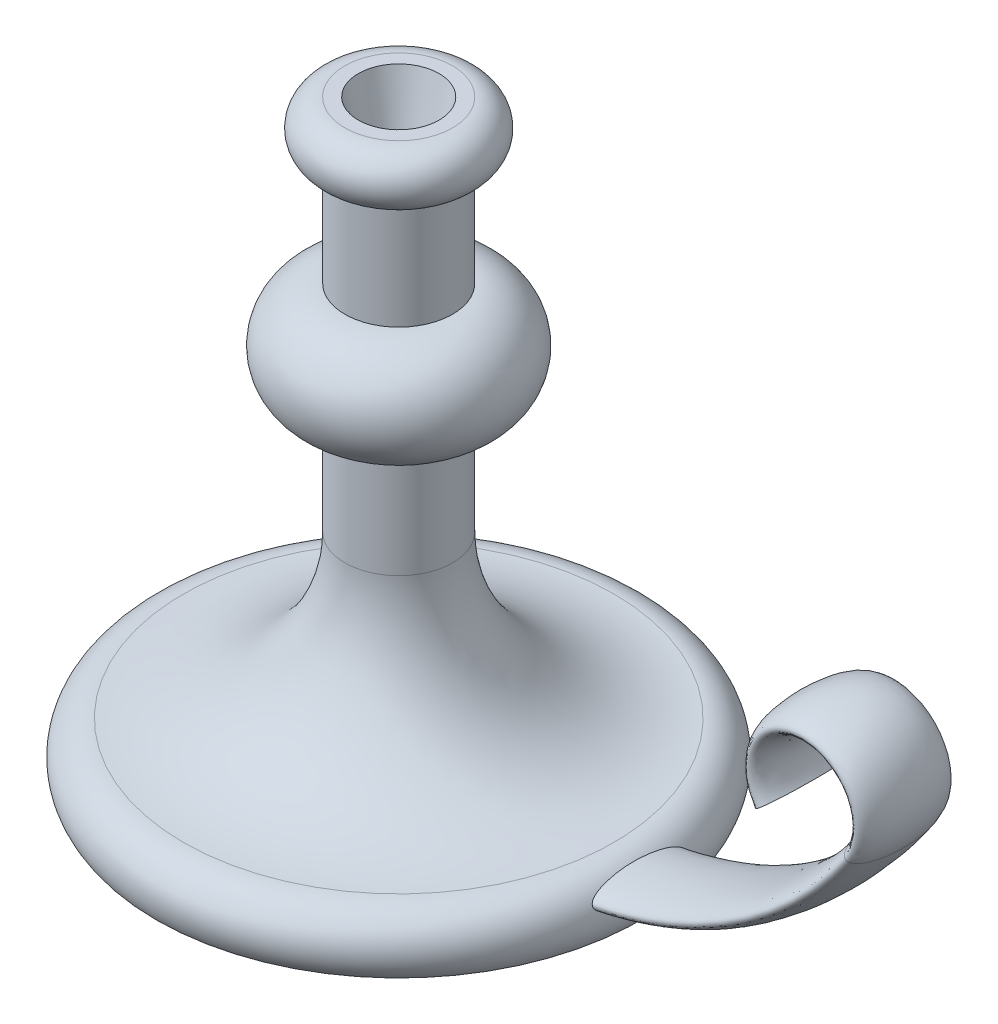
ISO-10303-21;
HEADER;
FILE_DESCRIPTION(('STEP AP214'),'2;1');
FILE_NAME('part.step','',(''),(''),'','','');
FILE_SCHEMA(('AUTOMOTIVE_DESIGN { 1 0 10303 214 1 1 1 1 }'));
ENDSEC;
DATA;
#1=APPLICATION_CONTEXT('core data for automotive mechanical design processes');
#2=APPLICATION_PROTOCOL_DEFINITION('international standard','automotive_design',2000,#1);
#3=PRODUCT_CONTEXT('',#1,'mechanical');
#4=PRODUCT('Part','Part','',(#3));
#5=PRODUCT_RELATED_PRODUCT_CATEGORY('part','',(#4));
#6=PRODUCT_DEFINITION_FORMATION('','',#4);
#7=PRODUCT_DEFINITION_CONTEXT('part definition',#1,'design');
#8=PRODUCT_DEFINITION('design','',#6,#7);
#9=PRODUCT_DEFINITION_SHAPE('','',#8);
#10=(LENGTH_UNIT() NAMED_UNIT(*) SI_UNIT(.MILLI.,.METRE.));
#11=(NAMED_UNIT(*) PLANE_ANGLE_UNIT() SI_UNIT($,.RADIAN.));
#12=(NAMED_UNIT(*) SI_UNIT($,.STERADIAN.) SOLID_ANGLE_UNIT());
#13=UNCERTAINTY_MEASURE_WITH_UNIT(LENGTH_MEASURE(1.E-05),#10,'distance_accuracy_value','');
#14=(GEOMETRIC_REPRESENTATION_CONTEXT(3) GLOBAL_UNCERTAINTY_ASSIGNED_CONTEXT((#13)) GLOBAL_UNIT_ASSIGNED_CONTEXT((#10,
#11,#12)) REPRESENTATION_CONTEXT('',''));
#15=CARTESIAN_POINT('',(0.,0.,0.));
#16=DIRECTION('',(0.,0.,1.));
#17=DIRECTION('',(1.,0.,0.));
#18=AXIS2_PLACEMENT_3D('',#15,#16,#17);
#19=CARTESIAN_POINT('',(0.,0.,0.));
#20=DIRECTION('',(0.,-1.,0.));
#21=DIRECTION('',(0.,0.,-1.));
#22=AXIS2_PLACEMENT_3D('',#19,#20,#21);
#23=PLANE('',#22);
#24=CARTESIAN_POINT('',(0.,0.,0.));
#25=DIRECTION('',(0.,-1.,0.));
#26=DIRECTION('',(0.,0.,-1.));
#27=AXIS2_PLACEMENT_3D('',#24,#25,#26);
#28=CIRCLE('',#27,90.);
#29=CARTESIAN_POINT('',(0.,0.,-90.));
#30=VERTEX_POINT('',#29);
#31=EDGE_CURVE('E82',#30,#30,#28,.T.);
#32=ORIENTED_EDGE('',*,*,#31,.T.);
#33=EDGE_LOOP('',(#32));
#34=FACE_BOUND('',#33,.T.);
#35=ADVANCED_FACE('F42',(#34),#23,.T.);
#36=CARTESIAN_POINT('',(0.,220.,0.));
#37=DIRECTION('',(0.,1.,0.));
#38=DIRECTION('',(0.,0.,1.));
#39=AXIS2_PLACEMENT_3D('',#36,#37,#38);
#40=PLANE('',#39);
#41=CARTESIAN_POINT('',(0.,220.,0.));
#42=DIRECTION('',(0.,1.,0.));
#43=DIRECTION('',(0.,0.,1.));
#44=AXIS2_PLACEMENT_3D('',#41,#42,#43);
#45=CIRCLE('',#44,15.);
#46=CARTESIAN_POINT('',(0.,220.,15.));
#47=VERTEX_POINT('',#46);
#48=EDGE_CURVE('E98',#47,#47,#45,.T.);
#49=ORIENTED_EDGE('',*,*,#48,.F.);
#50=EDGE_LOOP('',(#49));
#51=FACE_BOUND('',#50,.T.);
#52=CARTESIAN_POINT('',(0.,220.,0.));
#53=DIRECTION('',(0.,-1.,0.));
#54=DIRECTION('',(0.,0.,-1.));
#55=AXIS2_PLACEMENT_3D('',#52,#53,#54);
#56=CIRCLE('',#55,20.);
#57=CARTESIAN_POINT('',(0.,220.,-20.));
#58=VERTEX_POINT('',#57);
#59=EDGE_CURVE('E54',#58,#58,#56,.T.);
#60=ORIENTED_EDGE('',*,*,#59,.F.);
#61=EDGE_LOOP('',(#60));
#62=FACE_BOUND('',#61,.T.);
#63=ADVANCED_FACE('F105',(#51,#62),#40,.T.);
#64=CARTESIAN_POINT('',(0.,210.,0.));
#65=DIRECTION('',(0.,-1.,0.));
#66=DIRECTION('',(0.,0.,-1.));
#67=AXIS2_PLACEMENT_3D('',#64,#65,#66);
#68=TOROIDAL_SURFACE('',#67,20.,10.);
#69=ORIENTED_EDGE('',*,*,#59,.T.);
#70=EDGE_LOOP('',(#69));
#71=FACE_BOUND('',#70,.T.);
#72=CARTESIAN_POINT('',(0.,200.,0.));
#73=DIRECTION('',(0.,-1.,0.));
#74=DIRECTION('',(0.,0.,-1.));
#75=AXIS2_PLACEMENT_3D('',#72,#73,#74);
#76=CIRCLE('',#75,20.);
#77=CARTESIAN_POINT('',(0.,200.,-20.));
#78=VERTEX_POINT('',#77);
#79=EDGE_CURVE('E59',#78,#78,#76,.T.);
#80=ORIENTED_EDGE('',*,*,#79,.F.);
#81=EDGE_LOOP('',(#80));
#82=FACE_BOUND('',#81,.T.);
#83=ADVANCED_FACE('F108',(#71,#82),#68,.T.);
#84=CARTESIAN_POINT('',(0.,0.,0.));
#85=DIRECTION('',(0.,-1.,0.));
#86=DIRECTION('',(0.,0.,-1.));
#87=AXIS2_PLACEMENT_3D('',#84,#85,#86);
#88=CYLINDRICAL_SURFACE('',#87,20.);
#89=ORIENTED_EDGE('',*,*,#79,.T.);
#90=EDGE_LOOP('',(#89));
#91=FACE_BOUND('',#90,.T.);
#92=CARTESIAN_POINT('',(0.,160.,0.));
#93=DIRECTION('',(0.,-1.,0.));
#94=DIRECTION('',(0.,0.,-1.));
#95=AXIS2_PLACEMENT_3D('',#92,#93,#94);
#96=CIRCLE('',#95,20.);
#97=CARTESIAN_POINT('',(0.,160.,-20.));
#98=VERTEX_POINT('',#97);
#99=EDGE_CURVE('E64',#98,#98,#96,.T.);
#100=ORIENTED_EDGE('',*,*,#99,.F.);
#101=EDGE_LOOP('',(#100));
#102=FACE_BOUND('',#101,.T.);
#103=ADVANCED_FACE('F114',(#91,#102),#88,.T.);
#104=CARTESIAN_POINT('',(0.,140.,0.));
#105=DIRECTION('',(0.,-1.,0.));
#106=DIRECTION('',(0.,0.,-1.));
#107=AXIS2_PLACEMENT_3D('',#104,#105,#106);
#108=TOROIDAL_SURFACE('',#107,20.,20.);
#109=ORIENTED_EDGE('',*,*,#99,.T.);
#110=EDGE_LOOP('',(#109));
#111=FACE_BOUND('',#110,.T.);
#112=CARTESIAN_POINT('',(0.,120.,0.));
#113=DIRECTION('',(0.,-1.,0.));
#114=DIRECTION('',(0.,0.,-1.));
#115=AXIS2_PLACEMENT_3D('',#112,#113,#114);
#116=CIRCLE('',#115,20.);
#117=CARTESIAN_POINT('',(0.,120.,-20.));
#118=VERTEX_POINT('',#117);
#119=EDGE_CURVE('E70',#118,#118,#116,.T.);
#120=ORIENTED_EDGE('',*,*,#119,.F.);
#121=EDGE_LOOP('',(#120));
#122=FACE_BOUND('',#121,.T.);
#123=ADVANCED_FACE('F121',(#111,#122),#108,.T.);
#124=CARTESIAN_POINT('',(0.,0.,0.));
#125=DIRECTION('',(0.,-1.,0.));
#126=DIRECTION('',(0.,0.,-1.));
#127=AXIS2_PLACEMENT_3D('',#124,#125,#126);
#128=CYLINDRICAL_SURFACE('',#127,20.);
#129=ORIENTED_EDGE('',*,*,#119,.T.);
#130=EDGE_LOOP('',(#129));
#131=FACE_BOUND('',#130,.T.);
#132=CARTESIAN_POINT('',(0.,80.,0.));
#133=DIRECTION('',(0.,-1.,0.));
#134=DIRECTION('',(0.,0.,-1.));
#135=AXIS2_PLACEMENT_3D('',#132,#133,#134);
#136=CIRCLE('',#135,20.);
#137=CARTESIAN_POINT('',(0.,80.,-20.));
#138=VERTEX_POINT('',#137);
#139=EDGE_CURVE('E74',#138,#138,#136,.T.);
#140=ORIENTED_EDGE('',*,*,#139,.F.);
#141=EDGE_LOOP('',(#140));
#142=FACE_BOUND('',#141,.T.);
#143=ADVANCED_FACE('F125',(#131,#142),#128,.T.);
#144=CARTESIAN_POINT('',(0.,80.,0.));
#145=DIRECTION('',(0.,-1.,0.));
#146=DIRECTION('',(0.,0.,-1.));
#147=AXIS2_PLACEMENT_3D('',#144,#145,#146);
#148=TOROIDAL_SURFACE('',#147,80.,60.);
#149=ORIENTED_EDGE('',*,*,#139,.T.);
#150=EDGE_LOOP('',(#149));
#151=FACE_BOUND('',#150,.T.);
#152=CARTESIAN_POINT('',(0.,20.,0.));
#153=DIRECTION('',(0.,-1.,0.));
#154=DIRECTION('',(0.,0.,-1.));
#155=AXIS2_PLACEMENT_3D('',#152,#153,#154);
#156=CIRCLE('',#155,80.);
#157=CARTESIAN_POINT('',(0.,20.,-80.));
#158=VERTEX_POINT('',#157);
#159=EDGE_CURVE('E78',#158,#158,#156,.T.);
#160=ORIENTED_EDGE('',*,*,#159,.F.);
#161=EDGE_LOOP('',(#160));
#162=FACE_BOUND('',#161,.T.);
#163=ADVANCED_FACE('F129',(#151,#162),#148,.F.);
#164=CARTESIAN_POINT('',(0.,7.50000000000001,0.));
#165=DIRECTION('',(0.,-1.,0.));
#166=DIRECTION('',(0.,0.,-1.));
#167=AXIS2_PLACEMENT_3D('',#164,#165,#166);
#168=TOROIDAL_SURFACE('',#167,80.,12.5);
#169=CARTESIAN_POINT('',(89.5597422043342,12.9414346567555,17.5));
#170=CARTESIAN_POINT('',(89.5807278946485,12.8988393157081,17.5000019534777));
#171=CARTESIAN_POINT('',(89.6018125795404,12.8563039357769,17.4977816975197));
#172=CARTESIAN_POINT('',(89.6440155813562,12.7716938339371,17.489002543543));
#173=CARTESIAN_POINT('',(89.6651339056646,12.7296192360718,17.4824425050804));
#174=CARTESIAN_POINT('',(89.7283289297819,12.6045076597417,17.4565216692095));
#175=CARTESIAN_POINT('',(89.7702246464786,12.5226255894255,17.4309204730636));
#176=CARTESIAN_POINT('',(89.8644276523312,12.3407735771966,17.3563532007827));
#177=CARTESIAN_POINT('',(89.916211748319,12.242484901666,17.3027527423027));
#178=CARTESIAN_POINT('',(90.01638786814,12.0551458272008,17.178826321144));
#179=CARTESIAN_POINT('',(90.0647710548456,11.966119226993,17.1084587296403));
#180=CARTESIAN_POINT('',(90.1524531790238,11.806984522925,16.9652391551481));
#181=CARTESIAN_POINT('',(90.1921458014335,11.7358878994478,16.8936963434586));
#182=CARTESIAN_POINT('',(90.2690886261224,11.5996259068224,16.7438969488311));
#183=CARTESIAN_POINT('',(90.3063367280021,11.5344656201533,16.665634722265));
#184=CARTESIAN_POINT('',(90.3786756485819,11.4092540815106,16.5039763875565));
#185=CARTESIAN_POINT('',(90.4137624747614,11.349212210629,16.4205713158719));
#186=CARTESIAN_POINT('',(90.4819450166471,11.2336894025402,16.2499454917114));
#187=CARTESIAN_POINT('',(90.5150413047902,11.1782071523835,16.162725848809));
#188=CARTESIAN_POINT('',(90.5839705930101,11.063725182569,15.9728919395737));
#189=CARTESIAN_POINT('',(90.6195406839562,11.0053156128849,15.8698282905888));
#190=CARTESIAN_POINT('',(90.6886668526269,10.8929143897208,15.6606649910659));
#191=CARTESIAN_POINT('',(90.7222226971281,10.8389232475745,15.5545649910506));
#192=CARTESIAN_POINT('',(90.787486486134,10.7348751403119,15.3401290691865));
#193=CARTESIAN_POINT('',(90.8191972688173,10.6848120890841,15.2317969483067));
#194=CARTESIAN_POINT('',(90.881005962979,10.5880683385414,15.0131968985225));
#195=CARTESIAN_POINT('',(90.9111039714557,10.5413874357516,14.9029290865687));
#196=CARTESIAN_POINT('',(90.979897363352,10.4355491517099,14.6427529331226));
#197=CARTESIAN_POINT('',(91.0180072010883,10.377593665576,14.4922012075481));
#198=CARTESIAN_POINT('',(91.0918875553169,10.2663462891692,14.1888070722871));
#199=CARTESIAN_POINT('',(91.1276577411367,10.2130550577559,14.0359643425398));
#200=CARTESIAN_POINT('',(91.1971197458645,10.1105127689612,13.7282685712582));
#201=CARTESIAN_POINT('',(91.2308091946811,10.0612662985098,13.573413471871));
#202=CARTESIAN_POINT('',(91.2962483962878,9.966420445748,13.262180104172));
#203=CARTESIAN_POINT('',(91.3279980241889,9.92082129819993,13.1058017385396));
#204=CARTESIAN_POINT('',(91.4205951755327,9.78887458660798,12.6346162266685));
#205=CARTESIAN_POINT('',(91.4787589060981,9.70742476979595,12.3179025042442));
#206=CARTESIAN_POINT('',(91.5890957852254,9.55493826130153,11.6792188898602));
#207=CARTESIAN_POINT('',(91.641236506382,9.48395741425907,11.357230318611));
#208=CARTESIAN_POINT('',(91.7397682682944,9.35136221163198,10.7107316640823));
#209=CARTESIAN_POINT('',(91.7861636672357,9.28974074823247,10.3862236929834));
#210=CARTESIAN_POINT('',(91.873697660451,9.17463718318054,9.73512886653573));
#211=CARTESIAN_POINT('',(91.9148370779326,9.12115380666536,9.40854234516818));
#212=CARTESIAN_POINT('',(91.9930777751442,9.02031209920318,8.74630339912616));
#213=CARTESIAN_POINT('',(92.0300669877613,8.97311921137161,8.4106126926434));
#214=CARTESIAN_POINT('',(92.0991833927575,8.88559842477436,7.73783252743948));
#215=CARTESIAN_POINT('',(92.1313104056235,8.84527077946752,7.40074301754614));
#216=CARTESIAN_POINT('',(92.1909161961866,8.77092313439269,6.72537142355348));
#217=CARTESIAN_POINT('',(92.2183937480205,8.73690479789184,6.38708904887194));
#218=CARTESIAN_POINT('',(92.2688480816039,8.67476840304503,5.70964427774293));
#219=CARTESIAN_POINT('',(92.2918247141674,8.64665054027195,5.37048185250301));
#220=CARTESIAN_POINT('',(92.3540877228586,8.57076604630488,4.3536718124467));
#221=CARTESIAN_POINT('',(92.3868571977359,8.53128338370556,3.67498389641648));
#222=CARTESIAN_POINT('',(92.4356134743347,8.47274161832897,2.31614711504071));
#223=CARTESIAN_POINT('',(92.4515998737813,8.45368300509717,1.63599821506825));
#224=CARTESIAN_POINT('',(92.4661200478781,8.43637339284855,0.357955102331954));
#225=CARTESIAN_POINT('',(92.4665389208555,8.43587490179708,-0.239888856143647));
#226=CARTESIAN_POINT('',(92.4546362797528,8.4500624126083,-1.43536153859163));
#227=CARTESIAN_POINT('',(92.4423128974783,8.46475064105846,-2.03299021814841));
#228=CARTESIAN_POINT('',(92.4047541650815,8.5097668077993,-3.22745109478543));
#229=CARTESIAN_POINT('',(92.3795147316879,8.54009969200438,-3.82428298010723));
#230=CARTESIAN_POINT('',(92.3157217367252,8.61743320229677,-5.01694606233259));
#231=CARTESIAN_POINT('',(92.2771508465328,8.6644555239592,-5.61277493756129));
#232=CARTESIAN_POINT('',(92.1861026743767,8.77678784246256,-6.80153886380939));
#233=CARTESIAN_POINT('',(92.1336290020918,8.84209309262499,-7.3944746253509));
#234=CARTESIAN_POINT('',(92.0437550848418,8.95574227206711,-8.28055229820513));
#235=CARTESIAN_POINT('',(92.0119455213755,8.99622894552013,-8.57528682166727));
#236=CARTESIAN_POINT('',(91.9444204496405,9.08291539794888,-9.16346094428885));
#237=CARTESIAN_POINT('',(91.9087051114865,9.12911492811458,-9.45690059926715));
#238=CARTESIAN_POINT('',(91.8331309715697,9.22782929334068,-10.0422906036683));
#239=CARTESIAN_POINT('',(91.7932707518514,9.28034629056382,-10.3342404073468));
#240=CARTESIAN_POINT('',(91.7091179167369,9.3924506208163,-10.9161852811053));
#241=CARTESIAN_POINT('',(91.6648247441272,9.4520388428603,-11.2061801005452));
#242=CARTESIAN_POINT('',(91.571392572748,9.57931645333879,-11.7838191658169));
#243=CARTESIAN_POINT('',(91.5222504482681,9.64701107336925,-12.0714617643073));
#244=CARTESIAN_POINT('',(91.4186796874406,9.79172730085906,-12.6430805537631));
#245=CARTESIAN_POINT('',(91.3642572573635,9.86873798424095,-12.9270606150355));
#246=CARTESIAN_POINT('',(91.2493765391174,10.033952974788,-13.4904217181466));
#247=CARTESIAN_POINT('',(91.1889212109097,10.1221517983454,-13.7698049377448));
#248=CARTESIAN_POINT('',(91.0929373870874,10.2648274882363,-14.1839125047646));
#249=CARTESIAN_POINT('',(91.0600757486262,10.3140904181849,-14.3210581267387));
#250=CARTESIAN_POINT('',(90.9923938569386,10.4165511027192,-14.5933763477649));
#251=CARTESIAN_POINT('',(90.9575737807136,10.4697485018483,-14.7285491237344));
#252=CARTESIAN_POINT('',(90.8810851838776,10.5878451344079,-15.0138774923678));
#253=CARTESIAN_POINT('',(90.8391147723957,10.6533666208412,-15.1636969104748));
#254=CARTESIAN_POINT('',(90.7519625692612,10.7912189771815,-15.45932953559));
#255=CARTESIAN_POINT('',(90.7067794219568,10.8635527258308,-15.6051410149849));
#256=CARTESIAN_POINT('',(90.6128939496975,11.0160439629677,-15.8905749729623));
#257=CARTESIAN_POINT('',(90.5642084544311,11.0961646105685,-16.0302224467125));
#258=CARTESIAN_POINT('',(90.4624897667353,11.2662530107872,-16.3016394850687));
#259=CARTESIAN_POINT('',(90.4094613083907,11.3562100760681,-16.4334173639364));
#260=CARTESIAN_POINT('',(90.3114276481005,11.5255085385048,-16.6553108138959));
#261=CARTESIAN_POINT('',(90.2675273757817,11.6022608890606,-16.747864447136));
#262=CARTESIAN_POINT('',(90.1761749534326,11.7643292238687,-16.9236630994732));
#263=CARTESIAN_POINT('',(90.1287172073378,11.849658775493,-17.0068929161981));
#264=CARTESIAN_POINT('',(90.0292807633426,12.0313291797368,-17.160728121925));
#265=CARTESIAN_POINT('',(89.9772518064337,12.1277974407354,-17.2311575389091));
#266=CARTESIAN_POINT('',(89.8965437818878,12.2800613987941,-17.3212876850735));
#267=CARTESIAN_POINT('',(89.8692277989253,12.3320164153137,-17.3487242132161));
#268=CARTESIAN_POINT('',(89.8138320311431,12.4382955168478,-17.3975211145679));
#269=CARTESIAN_POINT('',(89.7857527202502,12.4926181439798,-17.4188851676711));
#270=CARTESIAN_POINT('',(89.7185869780335,12.6237048005598,-17.4611772226903));
#271=CARTESIAN_POINT('',(89.6792533408886,12.7013692224276,-17.4790502108363));
#272=CARTESIAN_POINT('',(89.6005512815564,12.8586256339485,-17.4997317533413));
#273=CARTESIAN_POINT('',(89.5611829132234,12.9382160139949,-17.5025524785485));
#274=CARTESIAN_POINT('',(89.4835317885697,13.0969633423244,-17.4927372657774));
#275=CARTESIAN_POINT('',(89.4452490812937,13.1761202708964,-17.4801006306501));
#276=CARTESIAN_POINT('',(89.3707047667355,13.3318071774563,-17.440649407729));
#277=CARTESIAN_POINT('',(89.3344452993772,13.4083343423531,-17.413820111618));
#278=CARTESIAN_POINT('',(89.2510611220236,13.5858554385683,-17.3357126521073));
#279=CARTESIAN_POINT('',(89.2050998650832,13.684982377722,-17.2790047620841));
#280=CARTESIAN_POINT('',(89.1180744174556,13.8744276311819,-17.1491670423827));
#281=CARTESIAN_POINT('',(89.0770301058259,13.9647099356686,-17.0759737821298));
#282=CARTESIAN_POINT('',(89.0037033744711,14.127143485757,-16.927057730704));
#283=CARTESIAN_POINT('',(88.9709541551903,14.2001945680732,-16.8525208708987));
#284=CARTESIAN_POINT('',(88.908496842619,14.3401811690449,-16.6970292692111));
#285=CARTESIAN_POINT('',(88.8787841266134,14.4071259665769,-16.6160846261893));
#286=CARTESIAN_POINT('',(88.8217814388549,14.5359995630882,-16.4490709627679));
#287=CARTESIAN_POINT('',(88.7944998605827,14.5979109242411,-16.3629857823211));
#288=CARTESIAN_POINT('',(88.742066743737,14.7171734064659,-16.1870697873632));
#289=CARTESIAN_POINT('',(88.7169159331093,14.77452296866,-16.0972377082952));
#290=CARTESIAN_POINT('',(88.6682699235337,14.8855899090512,-15.9140699306464));
#291=CARTESIAN_POINT('',(88.6447869137157,14.9392804489425,-15.8207148279061));
#292=CARTESIAN_POINT('',(88.5993971939428,15.0431008843881,-15.6316626961435));
#293=CARTESIAN_POINT('',(88.5774907604158,15.0932301555101,-15.5359652603526));
#294=CARTESIAN_POINT('',(88.5137514786221,15.2390285874185,-15.2458062448789));
#295=CARTESIAN_POINT('',(88.4739596847914,15.3299685477359,-15.0485147207849));
#296=CARTESIAN_POINT('',(88.3985337506615,15.5017775203625,-14.648715263339));
#297=CARTESIAN_POINT('',(88.362902963484,15.5826384140039,-14.4462032813476));
#298=CARTESIAN_POINT('',(88.2948356711213,15.7363066128671,-14.0365764701692));
#299=CARTESIAN_POINT('',(88.262414229517,15.8090761199815,-13.8294450545353));
#300=CARTESIAN_POINT('',(88.2003835751382,15.9473648801956,-13.4126289871763));
#301=CARTESIAN_POINT('',(88.1707714189814,16.0128917338222,-13.2029472733585));
#302=CARTESIAN_POINT('',(88.1139049361938,16.137737574562,-12.7814949946304));
#303=CARTESIAN_POINT('',(88.0866500408508,16.1970580597503,-12.5697249473631));
#304=CARTESIAN_POINT('',(88.027617257203,16.3244235662304,-12.091293170078));
#305=CARTESIAN_POINT('',(87.9964138193045,16.3909381265494,-11.8241540502346));
#306=CARTESIAN_POINT('',(87.9367717636618,16.5165936764719,-11.2878278414651));
#307=CARTESIAN_POINT('',(87.9083334164422,16.575733944766,-11.0186405549275));
#308=CARTESIAN_POINT('',(87.8539266282972,16.6875098948956,-10.4785408424884));
#309=CARTESIAN_POINT('',(87.8279593730488,16.7401424577995,-10.2076276543195));
#310=CARTESIAN_POINT('',(87.7783184309332,16.8395301522936,-9.66451167999842));
#311=CARTESIAN_POINT('',(87.7546448506397,16.8862850108118,-9.39230883453938));
#312=CARTESIAN_POINT('',(87.6869994555325,17.0182803050948,-8.57578965921804));
#313=CARTESIAN_POINT('',(87.6462388525847,17.0955854003687,-8.02991167225469));
#314=CARTESIAN_POINT('',(87.5728065515612,17.2320145687302,-6.93552385094017));
#315=CARTESIAN_POINT('',(87.5401330675683,17.2911426566327,-6.38701462498106));
#316=CARTESIAN_POINT('',(87.4828441952971,17.3930876120975,-5.28955884850922));
#317=CARTESIAN_POINT('',(87.4582074588681,17.4359477429322,-4.74061740412576));
#318=CARTESIAN_POINT('',(87.4169410999172,17.5068884934701,-3.64146108218768));
#319=CARTESIAN_POINT('',(87.4003119088603,17.5349683167839,-3.09124613761862));
#320=CARTESIAN_POINT('',(87.375169948199,17.5771566462025,-1.98980868969295));
#321=CARTESIAN_POINT('',(87.3666614689744,17.5912577671532,-1.4385858077221));
#322=CARTESIAN_POINT('',(87.3578539704596,17.6058511840595,-0.335909067646474));
#323=CARTESIAN_POINT('',(87.3575547550007,17.6063438052041,0.215544784624131));
#324=CARTESIAN_POINT('',(87.3651677510508,17.5937352162513,1.31815822776118));
#325=CARTESIAN_POINT('',(87.3730787250644,17.5806360547996,1.86931785044965));
#326=CARTESIAN_POINT('',(87.3970372477742,17.5404868292747,2.97097544677589));
#327=CARTESIAN_POINT('',(87.4130850653537,17.5134363041761,3.52147339794601));
#328=CARTESIAN_POINT('',(87.4531996813081,17.4446213827577,4.62112135666649));
#329=CARTESIAN_POINT('',(87.4772644593791,17.402860693302,5.17027166873998));
#330=CARTESIAN_POINT('',(87.533331677406,17.3033707612733,6.26670053623382));
#331=CARTESIAN_POINT('',(87.5653334299481,17.2456429015517,6.8139792495923));
#332=CARTESIAN_POINT('',(87.620822053123,17.1429049509086,7.65503321383614));
#333=CARTESIAN_POINT('',(87.6414679669259,17.1042333246742,7.94978028808745));
#334=CARTESIAN_POINT('',(87.6851649593455,17.0212250701556,8.53829462762091));
#335=CARTESIAN_POINT('',(87.708215967875,16.9768886069429,8.83206192119772));
#336=CARTESIAN_POINT('',(87.7568106691337,16.8820510369681,9.41827197236772));
#337=CARTESIAN_POINT('',(87.7823533406,16.8315524537747,9.71071522164725));
#338=CARTESIAN_POINT('',(87.8360989952264,16.7237193681051,10.2940938312741));
#339=CARTESIAN_POINT('',(87.8643018909556,16.6663850902743,10.5850292408467));
#340=CARTESIAN_POINT('',(87.9147712499547,16.5622842610506,11.0784529887216));
#341=CARTESIAN_POINT('',(87.9362980252953,16.5174691899792,11.2814293835327));
#342=CARTESIAN_POINT('',(87.9809118301303,16.4236835134753,11.6862455623069));
#343=CARTESIAN_POINT('',(88.0039988123353,16.3747130339805,11.8880853805184));
#344=CARTESIAN_POINT('',(88.0519198244942,16.2721215384762,12.2905621648837));
#345=CARTESIAN_POINT('',(88.0767553337323,16.2184965755432,12.4911979528407));
#346=CARTESIAN_POINT('',(88.1283787004667,16.1060707847341,12.8907612736831));
#347=CARTESIAN_POINT('',(88.1551664933022,16.0472701282666,13.0896888629014));
#348=CARTESIAN_POINT('',(88.2109999780503,15.9237718205578,13.4854201231404));
#349=CARTESIAN_POINT('',(88.2400459194857,15.8590735174967,13.6822235567004));
#350=CARTESIAN_POINT('',(88.3008027999432,15.7228691935854,14.0730419872891));
#351=CARTESIAN_POINT('',(88.3325134779583,15.6513638393846,14.2670572552395));
#352=CARTESIAN_POINT('',(88.3991424541959,15.5003948115861,14.6511973591133));
#353=CARTESIAN_POINT('',(88.4340575115816,15.4209391715428,14.8413258930656));
#354=CARTESIAN_POINT('',(88.5079196083048,15.2523848762567,15.2164401400166));
#355=CARTESIAN_POINT('',(88.5468648114129,15.1632906117651,15.4014281468488));
#356=CARTESIAN_POINT('',(88.609209623885,15.0206579718871,15.673311422964));
#357=CARTESIAN_POINT('',(88.6306485895101,14.9716086740026,15.7630166800369));
#358=CARTESIAN_POINT('',(88.6750422753312,14.8701248615223,15.9401002079371));
#359=CARTESIAN_POINT('',(88.6979967332496,14.81769093272,16.0274788777597));
#360=CARTESIAN_POINT('',(88.7456840101799,14.7089478844276,16.1993887567131));
#361=CARTESIAN_POINT('',(88.770417968827,14.6526362825893,16.2839180892541));
#362=CARTESIAN_POINT('',(88.8219484857479,14.5356422617906,16.4492391224752));
#363=CARTESIAN_POINT('',(88.8487445345047,14.4749609227746,16.5300317386029));
#364=CARTESIAN_POINT('',(88.8976102788187,14.364743484895,16.6667168433049));
#365=CARTESIAN_POINT('',(88.9191374191609,14.3163230322081,16.7236955334944));
#366=CARTESIAN_POINT('',(88.9637080676468,14.2164452982159,16.8342912802672));
#367=CARTESIAN_POINT('',(88.9867519478513,14.1649872721064,16.8879075056816));
#368=CARTESIAN_POINT('',(89.05836101815,14.0058008216798,17.0423310846554));
#369=CARTESIAN_POINT('',(89.1095289234105,13.8929758416958,17.1370796109723));
#370=CARTESIAN_POINT('',(89.1999001554575,13.6963386208976,17.2707956184664));
#371=CARTESIAN_POINT('',(89.2367505169322,13.6167644879684,17.3175503480629));
#372=CARTESIAN_POINT('',(89.313687765385,13.4522974166012,17.3968468737186));
#373=CARTESIAN_POINT('',(89.3537667767866,13.3674175273966,17.4294220837181));
#374=CARTESIAN_POINT('',(89.4217091217893,13.2251848973543,17.4685967336683));
#375=CARTESIAN_POINT('',(89.448809384098,13.1688551716177,17.4803204652976));
#376=CARTESIAN_POINT('',(89.5037947740349,13.0554594934972,17.4960211898048));
#377=CARTESIAN_POINT('',(89.5316799819,12.9983934661741,17.499997387795));
#378=CARTESIAN_POINT('',(89.5597422043342,12.9414346567555,17.5));
#379=B_SPLINE_CURVE_WITH_KNOTS('',3,(#169,#170,#171,#172,#173,#174,#175,#176,#177,#178,#179,
#180,#181,#182,#183,#184,#185,#186,#187,#188,#189,#190,#191,#192,#193,#194,#195,#196,#197,#198,
#199,#200,#201,#202,#203,#204,#205,#206,#207,#208,#209,#210,#211,#212,#213,#214,#215,#216,#217,
#218,#219,#220,#221,#222,#223,#224,#225,#226,#227,#228,#229,#230,#231,#232,#233,#234,#235,#236,
#237,#238,#239,#240,#241,#242,#243,#244,#245,#246,#247,#248,#249,#250,#251,#252,#253,#254,#255,
#256,#257,#258,#259,#260,#261,#262,#263,#264,#265,#266,#267,#268,#269,#270,#271,#272,#273,#274,
#275,#276,#277,#278,#279,#280,#281,#282,#283,#284,#285,#286,#287,#288,#289,#290,#291,#292,#293,
#294,#295,#296,#297,#298,#299,#300,#301,#302,#303,#304,#305,#306,#307,#308,#309,#310,#311,#312,
#313,#314,#315,#316,#317,#318,#319,#320,#321,#322,#323,#324,#325,#326,#327,#328,#329,#330,#331,
#332,#333,#334,#335,#336,#337,#338,#339,#340,#341,#342,#343,#344,#345,#346,#347,#348,#349,#350,
#351,#352,#353,#354,#355,#356,#357,#358,#359,#360,#361,#362,#363,#364,#365,#366,#367,#368,#369,
#370,#371,#372,#373,#374,#375,#376,#377,#378),.UNSPECIFIED.,.T.,.F.,(4,2,2,2,2,2,2,2,2,2,2,2,2,
2,2,2,2,2,2,2,2,2,2,2,2,2,2,2,2,2,2,2,2,2,2,2,2,2,2,2,2,2,2,2,2,2,2,2,2,2,2,2,2,2,2,2,2,2,2,2,2,
2,2,2,2,2,2,2,2,2,2,2,2,2,2,2,2,2,2,2,2,2,2,2,2,2,2,2,2,2,2,2,2,2,2,2,2,2,2,2,2,2,2,2,4),(0.,
0.142381357158817,0.284800145338807,0.569778369710398,0.937790990160505,1.30672699797601,
1.63143353328551,1.95641550824169,2.28198085179474,2.60745211744528,2.97835758825745,
3.34930592253141,3.71966767593573,4.09000712931063,4.58717127025775,5.08440552627601,
5.58219609730419,6.08001868322203,7.07612740491147,8.07737111401415,9.07785060328475,
10.0781732018629,11.1010679437462,12.1240004418369,13.1472022244407,14.1704379160043,
16.2117115539474,18.2530341182273,20.0462457692419,21.839720367684,23.6337623045227,
25.4301450150665,27.2260617741975,28.1235892294177,29.0210776087004,29.9188740333847,
30.8167834514322,31.7152755049921,32.6127240115718,33.5097343419004,33.9578247270815,
34.4058746792329,34.9121604747938,35.4186611861169,35.9228725276492,36.4265413835618,
36.8100240505595,37.1941231504199,37.5831580539592,37.7772586450041,37.9712413599168,
38.2366258142317,38.50179565338,38.766977452507,39.0324346081148,39.3996555983548,
39.7683144393121,40.0959866375239,40.4231523204128,40.7514069982212,41.0797733710076,
41.4103344436378,41.7409533344652,42.4030339566269,43.0656444835731,43.7312306850949,
44.3961116446153,45.0608317450501,45.8918608553076,46.7229711882497,47.5544783139753,
48.3860240564146,50.0440426041171,51.7016946763006,53.3549069476179,55.0082082878444,
56.6623826267326,58.316517437417,59.9704029618912,61.6243431428191,63.2778668395622,
64.9312473761655,65.8251617717395,66.7190501248683,67.6125736254202,68.5060677696829,
69.1329546330659,69.7598225042287,70.3872272415085,71.0146112082208,71.6420645989508,
72.2694566030654,72.8962209263447,73.5227009279513,73.836017519839,74.1492800292296,
74.4627449766593,74.7761327179491,75.009418944319,75.242762611334,75.7080186392216,
76.0052441465111,76.3017654013239,76.4921392885518,76.6825327068869),.UNSPECIFIED.);
#380=CARTESIAN_POINT('',(89.5597422043342,12.9414346567555,17.5));
#381=VERTEX_POINT('',#380);
#382=EDGE_CURVE('E10',#381,#381,#379,.T.);
#383=ORIENTED_EDGE('',*,*,#382,.F.);
#384=EDGE_LOOP('',(#383));
#385=FACE_BOUND('',#384,.T.);
#386=ORIENTED_EDGE('',*,*,#159,.T.);
#387=EDGE_LOOP('',(#386));
#388=FACE_BOUND('',#387,.T.);
#389=ORIENTED_EDGE('',*,*,#31,.F.);
#390=EDGE_LOOP('',(#389));
#391=FACE_BOUND('',#390,.T.);
#392=ADVANCED_FACE('F132',(#385,#388,#391),#168,.T.);
#393=CARTESIAN_POINT('',(150.634185358261,75.,0.));
#394=DIRECTION('',(0.566666666666667,-0.823947139620552,0.));
#395=DIRECTION('',(0.,0.,-1.));
#396=AXIS2_PLACEMENT_3D('',#393,#394,#395);
#397=PLANE('',#396);
#398=CARTESIAN_POINT('',(150.634185358261,75.,0.));
#399=DIRECTION('',(0.566666666666667,-0.823947139620552,0.));
#400=DIRECTION('',(0.,0.,1.));
#401=AXIS2_PLACEMENT_3D('',#398,#399,#400);
#402=ELLIPSE('',#401,17.5,4.99999999999999);
#403=CARTESIAN_POINT('',(150.634185358261,75.,17.5));
#404=VERTEX_POINT('',#403);
#405=EDGE_CURVE('E86',#404,#404,#402,.T.);
#406=ORIENTED_EDGE('',*,*,#405,.T.);
#407=EDGE_LOOP('',(#406));
#408=FACE_BOUND('',#407,.T.);
#409=ADVANCED_FACE('F137',(#408),#397,.T.);
#410=CARTESIAN_POINT('',(60.,10.,17.5));
#411=CARTESIAN_POINT('',(110.410191303973,10.,17.5));
#412=CARTESIAN_POINT('',(155.026295870831,33.4646670673665,17.5));
#413=CARTESIAN_POINT('',(183.592070943083,75.,17.5));
#414=CARTESIAN_POINT('',(60.,0.,17.5));
#415=CARTESIAN_POINT('',(113.770870724238,0.,17.5));
#416=CARTESIAN_POINT('',(161.36138226222,25.0289782051909,17.5));
#417=CARTESIAN_POINT('',(191.831542339288,69.3333333333333,17.5));
#418=CARTESIAN_POINT('',(60.,0.,-17.5));
#419=CARTESIAN_POINT('',(113.770870724238,0.,-17.5));
#420=CARTESIAN_POINT('',(161.36138226222,25.0289782051909,-17.5));
#421=CARTESIAN_POINT('',(191.831542339288,69.3333333333333,-17.5));
#422=CARTESIAN_POINT('',(60.,9.99999999999999,-17.5));
#423=CARTESIAN_POINT('',(110.410191303973,9.99999999999999,-17.5));
#424=CARTESIAN_POINT('',(155.026295870831,33.4646670673665,-17.5));
#425=CARTESIAN_POINT('',(183.592070943083,74.9999999999999,-17.5));
#426=CARTESIAN_POINT('',(60.,20.,-17.5));
#427=CARTESIAN_POINT('',(107.049511883708,20.,-17.5));
#428=CARTESIAN_POINT('',(148.691209479443,41.900355929542,-17.5));
#429=CARTESIAN_POINT('',(175.352599546877,80.6666666666666,-17.5));
#430=CARTESIAN_POINT('',(60.,20.,17.5));
#431=CARTESIAN_POINT('',(107.049511883708,20.,17.5));
#432=CARTESIAN_POINT('',(148.691209479443,41.900355929542,17.5));
#433=CARTESIAN_POINT('',(175.352599546877,80.6666666666666,17.5));
#434=CARTESIAN_POINT('',(60.,10.,17.5));
#435=CARTESIAN_POINT('',(110.410191303973,10.,17.5));
#436=CARTESIAN_POINT('',(155.026295870831,33.4646670673665,17.5));
#437=CARTESIAN_POINT('',(183.592070943083,75.,17.5));
#438=(BOUNDED_SURFACE() B_SPLINE_SURFACE(3,3,((#410,#411,#412,#413),(#414,#415,#416,#417),(#418,
#419,#420,#421),(#422,#423,#424,#425),(#426,#427,#428,#429),(#430,#431,#432,#433),(#434,#435,
#436,#437)),.UNSPECIFIED.,.T.,.F.,.F.) B_SPLINE_SURFACE_WITH_KNOTS((4,3,4),(4,4),(0.,0.5,1.),
(0.,1.),.UNSPECIFIED.) GEOMETRIC_REPRESENTATION_ITEM() RATIONAL_B_SPLINE_SURFACE(((1.,
0.923374135437856,0.923374135437856,1.),(0.333333333333333,0.307791378479285,0.307791378479285,
0.333333333333333),(0.333333333333333,0.307791378479285,0.307791378479285,0.333333333333333),
(1.,0.923374135437856,0.923374135437856,1.),(0.333333333333333,0.307791378479285,
0.307791378479285,0.333333333333333),(0.333333333333333,0.307791378479285,0.307791378479285,
0.333333333333333),(1.,0.923374135437856,0.923374135437856,1.))) REPRESENTATION_ITEM('') SURFACE());
#439=CARTESIAN_POINT('',(183.592070943083,75.,0.));
#440=DIRECTION('',(0.566666666666667,0.823947139620552,0.));
#441=DIRECTION('',(0.,0.,1.));
#442=AXIS2_PLACEMENT_3D('',#439,#440,#441);
#443=ELLIPSE('',#442,17.5,4.99999999999999);
#444=CARTESIAN_POINT('',(183.592070943083,75.,17.5));
#445=VERTEX_POINT('',#444);
#446=EDGE_CURVE('E90',#445,#445,#443,.T.);
#447=ORIENTED_EDGE('',*,*,#382,.T.);
#448=EDGE_LOOP('',(#447));
#449=FACE_BOUND('',#448,.T.);
#450=ORIENTED_EDGE('',*,*,#446,.F.);
#451=EDGE_LOOP('',(#450));
#452=FACE_BOUND('',#451,.T.);
#453=ADVANCED_FACE('F142',(#449,#452),#438,.T.);
#454=CARTESIAN_POINT('',(183.592070943083,75.,17.5));
#455=CARTESIAN_POINT('',(193.981461744242,90.10642735238,17.5));
#456=CARTESIAN_POINT('',(185.447347211541,106.333333333333,17.5));
#457=CARTESIAN_POINT('',(167.113128150672,106.333333333333,17.5));
#458=CARTESIAN_POINT('',(148.778909089802,106.333333333333,17.5));
#459=CARTESIAN_POINT('',(140.244794557101,90.1064273523801,17.5));
#460=CARTESIAN_POINT('',(150.634185358261,75.,17.5));
#461=CARTESIAN_POINT('',(191.831542339288,69.3333333333333,17.5));
#462=CARTESIAN_POINT('',(207.415628541027,91.9929743619034,17.5));
#463=CARTESIAN_POINT('',(194.614456741976,116.333333333333,17.5));
#464=CARTESIAN_POINT('',(167.113128150672,116.333333333333,17.5));
#465=CARTESIAN_POINT('',(139.611799559367,116.333333333333,17.5));
#466=CARTESIAN_POINT('',(126.810627760316,91.9929743619035,17.5));
#467=CARTESIAN_POINT('',(142.394713962055,69.3333333333334,17.5));
#468=CARTESIAN_POINT('',(191.831542339288,69.3333333333333,-17.5));
#469=CARTESIAN_POINT('',(207.415628541027,91.9929743619034,-17.5));
#470=CARTESIAN_POINT('',(194.614456741976,116.333333333333,-17.5));
#471=CARTESIAN_POINT('',(167.113128150672,116.333333333333,-17.5));
#472=CARTESIAN_POINT('',(139.611799559367,116.333333333333,-17.5));
#473=CARTESIAN_POINT('',(126.810627760316,91.9929743619035,-17.5));
#474=CARTESIAN_POINT('',(142.394713962055,69.3333333333334,-17.5));
#475=CARTESIAN_POINT('',(183.592070943083,75.,-17.5));
#476=CARTESIAN_POINT('',(193.981461744242,90.10642735238,-17.5));
#477=CARTESIAN_POINT('',(185.447347211541,106.333333333333,-17.5));
#478=CARTESIAN_POINT('',(167.113128150672,106.333333333333,-17.5));
#479=CARTESIAN_POINT('',(148.778909089802,106.333333333333,-17.5));
#480=CARTESIAN_POINT('',(140.244794557101,90.1064273523801,-17.5));
#481=CARTESIAN_POINT('',(150.634185358261,75.,-17.5));
#482=CARTESIAN_POINT('',(175.352599546877,80.6666666666667,-17.5));
#483=CARTESIAN_POINT('',(180.547294947457,88.2198803428567,-17.5));
#484=CARTESIAN_POINT('',(176.280237681107,96.3333333333333,-17.5));
#485=CARTESIAN_POINT('',(167.113128150672,96.3333333333334,-17.5));
#486=CARTESIAN_POINT('',(157.946018620237,96.3333333333334,-17.5));
#487=CARTESIAN_POINT('',(153.678961353887,88.2198803428568,-17.5));
#488=CARTESIAN_POINT('',(158.873656754466,80.6666666666667,-17.5));
#489=CARTESIAN_POINT('',(175.352599546877,80.6666666666667,17.5));
#490=CARTESIAN_POINT('',(180.547294947457,88.2198803428567,17.5));
#491=CARTESIAN_POINT('',(176.280237681107,96.3333333333333,17.5));
#492=CARTESIAN_POINT('',(167.113128150672,96.3333333333333,17.5));
#493=CARTESIAN_POINT('',(157.946018620237,96.3333333333334,17.5));
#494=CARTESIAN_POINT('',(153.678961353887,88.2198803428568,17.5));
#495=CARTESIAN_POINT('',(158.873656754466,80.6666666666667,17.5));
#496=CARTESIAN_POINT('',(183.592070943083,75.,17.5));
#497=CARTESIAN_POINT('',(193.981461744242,90.10642735238,17.5));
#498=CARTESIAN_POINT('',(185.447347211541,106.333333333333,17.5));
#499=CARTESIAN_POINT('',(167.113128150672,106.333333333333,17.5));
#500=CARTESIAN_POINT('',(148.778909089802,106.333333333333,17.5));
#501=CARTESIAN_POINT('',(140.244794557101,90.1064273523801,17.5));
#502=CARTESIAN_POINT('',(150.634185358261,75.,17.5));
#503=(BOUNDED_SURFACE() B_SPLINE_SURFACE(3,3,((#454,#455,#456,#457,#458,#459,#460),(#461,#462,
#463,#464,#465,#466,#467),(#468,#469,#470,#471,#472,#473,#474),(#475,#476,#477,#478,#479,#480,
#481),(#482,#483,#484,#485,#486,#487,#488),(#489,#490,#491,#492,#493,#494,#495),(#496,#497,#498,
#499,#500,#501,#502)),.UNSPECIFIED.,.T.,.F.,.F.) B_SPLINE_SURFACE_WITH_KNOTS((4,3,4),(4,3,4),
(0.,0.5,1.),(0.,0.5,1.),
.UNSPECIFIED.) GEOMETRIC_REPRESENTATION_ITEM() RATIONAL_B_SPLINE_SURFACE(((1.,0.64364977875042,
0.64364977875042,1.,0.64364977875042,0.64364977875042,1.),(0.333333333333333,0.21454992625014,
0.21454992625014,0.333333333333333,0.21454992625014,0.21454992625014,0.333333333333333),
(0.333333333333333,0.21454992625014,0.21454992625014,0.333333333333333,0.21454992625014,
0.21454992625014,0.333333333333333),(1.,0.64364977875042,0.64364977875042,1.,0.64364977875042,
0.64364977875042,1.),(0.333333333333333,0.21454992625014,0.21454992625014,0.333333333333333,
0.21454992625014,0.21454992625014,0.333333333333333),(0.333333333333333,0.21454992625014,
0.21454992625014,0.333333333333333,0.21454992625014,0.21454992625014,0.333333333333333),(1.,
0.64364977875042,0.64364977875042,1.,0.64364977875042,0.64364977875042,1.))) REPRESENTATION_ITEM('') SURFACE());
#504=ORIENTED_EDGE('',*,*,#405,.F.);
#505=EDGE_LOOP('',(#504));
#506=FACE_BOUND('',#505,.T.);
#507=ORIENTED_EDGE('',*,*,#446,.T.);
#508=EDGE_LOOP('',(#507));
#509=FACE_BOUND('',#508,.T.);
#510=ADVANCED_FACE('F139',(#506,#509),#503,.T.);
#511=CARTESIAN_POINT('',(0.,220.,0.));
#512=DIRECTION('',(0.,1.,0.));
#513=DIRECTION('',(0.,0.,1.));
#514=AXIS2_PLACEMENT_3D('',#511,#512,#513);
#515=CONICAL_SURFACE('',#514,15.,0.26179938779915);
#516=CARTESIAN_POINT('',(0.,195.,0.));
#517=DIRECTION('',(0.,1.,0.));
#518=DIRECTION('',(0.,0.,1.));
#519=AXIS2_PLACEMENT_3D('',#516,#517,#518);
#520=CIRCLE('',#519,8.30127018922192);
#521=CARTESIAN_POINT('',(0.,195.,8.30127018922192));
#522=VERTEX_POINT('',#521);
#523=EDGE_CURVE('E94',#522,#522,#520,.T.);
#524=ORIENTED_EDGE('',*,*,#523,.F.);
#525=EDGE_LOOP('',(#524));
#526=FACE_BOUND('',#525,.T.);
#527=ORIENTED_EDGE('',*,*,#48,.T.);
#528=EDGE_LOOP('',(#527));
#529=FACE_BOUND('',#528,.T.);
#530=ADVANCED_FACE('F103',(#526,#529),#515,.F.);
#531=CARTESIAN_POINT('',(0.,195.,0.));
#532=DIRECTION('',(0.,1.,0.));
#533=DIRECTION('',(0.,0.,1.));
#534=AXIS2_PLACEMENT_3D('',#531,#532,#533);
#535=PLANE('',#534);
#536=ORIENTED_EDGE('',*,*,#523,.T.);
#537=EDGE_LOOP('',(#536));
#538=FACE_BOUND('',#537,.T.);
#539=ADVANCED_FACE('F163',(#538),#535,.T.);
#540=CLOSED_SHELL('',(#35,#63,#83,#103,#123,#143,#163,#392,#409,#453,#510,#530,#539));
#541=MANIFOLD_SOLID_BREP('B2',#540);
#542=ADVANCED_BREP_SHAPE_REPRESENTATION('',(#18,#541),#14);
#543=SHAPE_DEFINITION_REPRESENTATION(#9,#542);
ENDSEC;
END-ISO-10303-21;
